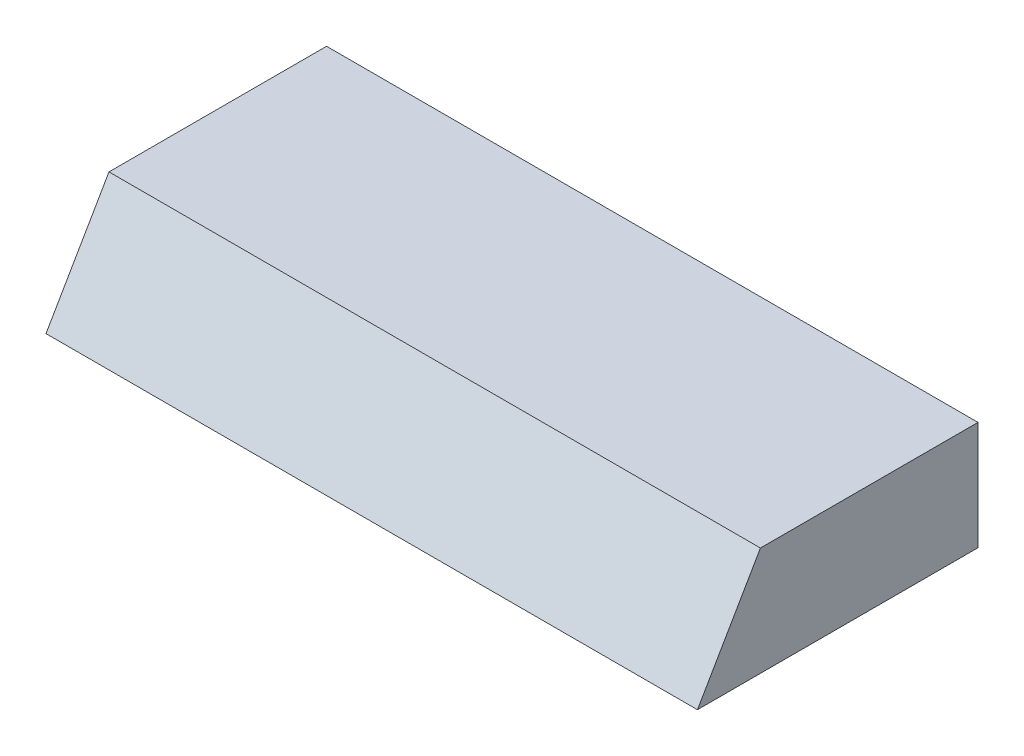
ISO-10303-21;
HEADER;
FILE_DESCRIPTION(('STEP AP214'),'2;1');
FILE_NAME('part.step','',(''),(''),'','','');
FILE_SCHEMA(('AUTOMOTIVE_DESIGN { 1 0 10303 214 1 1 1 1 }'));
ENDSEC;
DATA;
#1=APPLICATION_CONTEXT('core data for automotive mechanical design processes');
#2=APPLICATION_PROTOCOL_DEFINITION('international standard','automotive_design',2000,#1);
#3=PRODUCT_CONTEXT('',#1,'mechanical');
#4=PRODUCT('Part','Part','',(#3));
#5=PRODUCT_RELATED_PRODUCT_CATEGORY('part','',(#4));
#6=PRODUCT_DEFINITION_FORMATION('','',#4);
#7=PRODUCT_DEFINITION_CONTEXT('part definition',#1,'design');
#8=PRODUCT_DEFINITION('design','',#6,#7);
#9=PRODUCT_DEFINITION_SHAPE('','',#8);
#10=(LENGTH_UNIT() NAMED_UNIT(*) SI_UNIT(.MILLI.,.METRE.));
#11=(NAMED_UNIT(*) PLANE_ANGLE_UNIT() SI_UNIT($,.RADIAN.));
#12=(NAMED_UNIT(*) SI_UNIT($,.STERADIAN.) SOLID_ANGLE_UNIT());
#13=UNCERTAINTY_MEASURE_WITH_UNIT(LENGTH_MEASURE(1.E-05),#10,'distance_accuracy_value','');
#14=(GEOMETRIC_REPRESENTATION_CONTEXT(3) GLOBAL_UNCERTAINTY_ASSIGNED_CONTEXT((#13)) GLOBAL_UNIT_ASSIGNED_CONTEXT((#10,
#11,#12)) REPRESENTATION_CONTEXT('',''));
#15=CARTESIAN_POINT('',(0.,0.,0.));
#16=DIRECTION('',(0.,0.,1.));
#17=DIRECTION('',(1.,0.,0.));
#18=AXIS2_PLACEMENT_3D('',#15,#16,#17);
#19=CARTESIAN_POINT('',(-15.,-2.5,12.92));
#20=DIRECTION('',(1.,0.,0.));
#21=DIRECTION('',(0.,0.,-1.));
#22=AXIS2_PLACEMENT_3D('',#19,#20,#21);
#23=PLANE('',#22);
#24=DIRECTION('',(0.,0.,-1.));
#25=VECTOR('',#24,1.);
#26=CARTESIAN_POINT('',(-15.,-2.5,12.92));
#27=LINE('',#26,#25);
#28=CARTESIAN_POINT('',(-15.,-2.5,12.92));
#29=VERTEX_POINT('',#28);
#30=CARTESIAN_POINT('',(-15.,-2.5,0.));
#31=VERTEX_POINT('',#30);
#32=EDGE_CURVE('E11',#29,#31,#27,.T.);
#33=ORIENTED_EDGE('',*,*,#32,.F.);
#34=DIRECTION('',(0.,0.865031189261803,-0.501718089771846));
#35=VECTOR('',#34,1.);
#36=CARTESIAN_POINT('',(-15.,-2.5,12.92));
#37=LINE('',#36,#35);
#38=CARTESIAN_POINT('',(-15.,2.5,10.02));
#39=VERTEX_POINT('',#38);
#40=EDGE_CURVE('E48',#29,#39,#37,.T.);
#41=ORIENTED_EDGE('',*,*,#40,.T.);
#42=DIRECTION('',(0.,0.,-1.));
#43=VECTOR('',#42,1.);
#44=CARTESIAN_POINT('',(-15.,2.5,12.92));
#45=LINE('',#44,#43);
#46=CARTESIAN_POINT('',(-15.,2.5,0.));
#47=VERTEX_POINT('',#46);
#48=EDGE_CURVE('E77',#39,#47,#45,.T.);
#49=ORIENTED_EDGE('',*,*,#48,.T.);
#50=DIRECTION('',(0.,-1.,0.));
#51=VECTOR('',#50,1.);
#52=CARTESIAN_POINT('',(-15.,-2.5,0.));
#53=LINE('',#52,#51);
#54=EDGE_CURVE('E89',#47,#31,#53,.T.);
#55=ORIENTED_EDGE('',*,*,#54,.T.);
#56=EDGE_LOOP('',(#33,#41,#49,#55));
#57=FACE_BOUND('',#56,.T.);
#58=ADVANCED_FACE('F33',(#57),#23,.F.);
#59=CARTESIAN_POINT('',(15.,-2.5,12.92));
#60=DIRECTION('',(0.,1.,0.));
#61=DIRECTION('',(-1.,0.,0.));
#62=AXIS2_PLACEMENT_3D('',#59,#60,#61);
#63=PLANE('',#62);
#64=DIRECTION('',(1.,0.,0.));
#65=VECTOR('',#64,1.);
#66=CARTESIAN_POINT('',(15.,-2.5,0.));
#67=LINE('',#66,#65);
#68=CARTESIAN_POINT('',(15.,-2.5,0.));
#69=VERTEX_POINT('',#68);
#70=EDGE_CURVE('E85',#31,#69,#67,.T.);
#71=ORIENTED_EDGE('',*,*,#70,.T.);
#72=DIRECTION('',(0.,0.,-1.));
#73=VECTOR('',#72,1.);
#74=CARTESIAN_POINT('',(15.,-2.5,12.92));
#75=LINE('',#74,#73);
#76=CARTESIAN_POINT('',(15.,-2.5,12.92));
#77=VERTEX_POINT('',#76);
#78=EDGE_CURVE('E41',#77,#69,#75,.T.);
#79=ORIENTED_EDGE('',*,*,#78,.F.);
#80=DIRECTION('',(1.,0.,0.));
#81=VECTOR('',#80,1.);
#82=CARTESIAN_POINT('',(15.,-2.5,12.92));
#83=LINE('',#82,#81);
#84=EDGE_CURVE('E90',#29,#77,#83,.T.);
#85=ORIENTED_EDGE('',*,*,#84,.F.);
#86=ORIENTED_EDGE('',*,*,#32,.T.);
#87=EDGE_LOOP('',(#71,#79,#85,#86));
#88=FACE_BOUND('',#87,.T.);
#89=ADVANCED_FACE('F104',(#88),#63,.F.);
#90=CARTESIAN_POINT('',(15.,-2.5,12.92));
#91=DIRECTION('',(-1.,0.,0.));
#92=DIRECTION('',(0.,0.,1.));
#93=AXIS2_PLACEMENT_3D('',#90,#91,#92);
#94=PLANE('',#93);
#95=DIRECTION('',(0.,0.,-1.));
#96=VECTOR('',#95,1.);
#97=CARTESIAN_POINT('',(15.,2.5,12.92));
#98=LINE('',#97,#96);
#99=CARTESIAN_POINT('',(15.,2.5,10.02));
#100=VERTEX_POINT('',#99);
#101=CARTESIAN_POINT('',(15.,2.5,0.));
#102=VERTEX_POINT('',#101);
#103=EDGE_CURVE('E66',#100,#102,#98,.T.);
#104=ORIENTED_EDGE('',*,*,#103,.F.);
#105=DIRECTION('',(0.,0.865031189261803,-0.501718089771846));
#106=VECTOR('',#105,1.);
#107=CARTESIAN_POINT('',(15.,2.5,10.02));
#108=LINE('',#107,#106);
#109=EDGE_CURVE('E99',#77,#100,#108,.T.);
#110=ORIENTED_EDGE('',*,*,#109,.F.);
#111=ORIENTED_EDGE('',*,*,#78,.T.);
#112=DIRECTION('',(0.,1.,0.));
#113=VECTOR('',#112,1.);
#114=CARTESIAN_POINT('',(15.,-2.5,0.));
#115=LINE('',#114,#113);
#116=EDGE_CURVE('E81',#69,#102,#115,.T.);
#117=ORIENTED_EDGE('',*,*,#116,.T.);
#118=EDGE_LOOP('',(#104,#110,#111,#117));
#119=FACE_BOUND('',#118,.T.);
#120=ADVANCED_FACE('F82',(#119),#94,.F.);
#121=CARTESIAN_POINT('',(15.,2.5,12.92));
#122=DIRECTION('',(0.,-1.,0.));
#123=DIRECTION('',(1.,0.,0.));
#124=AXIS2_PLACEMENT_3D('',#121,#122,#123);
#125=PLANE('',#124);
#126=ORIENTED_EDGE('',*,*,#48,.F.);
#127=DIRECTION('',(1.,0.,0.));
#128=VECTOR('',#127,1.);
#129=CARTESIAN_POINT('',(-21.,2.5,10.02));
#130=LINE('',#129,#128);
#131=EDGE_CURVE('E74',#39,#100,#130,.T.);
#132=ORIENTED_EDGE('',*,*,#131,.T.);
#133=ORIENTED_EDGE('',*,*,#103,.T.);
#134=DIRECTION('',(-1.,0.,0.));
#135=VECTOR('',#134,1.);
#136=CARTESIAN_POINT('',(15.,2.5,0.));
#137=LINE('',#136,#135);
#138=EDGE_CURVE('E71',#102,#47,#137,.T.);
#139=ORIENTED_EDGE('',*,*,#138,.T.);
#140=EDGE_LOOP('',(#126,#132,#133,#139));
#141=FACE_BOUND('',#140,.T.);
#142=ADVANCED_FACE('F69',(#141),#125,.F.);
#143=CARTESIAN_POINT('',(0.,0.,0.));
#144=DIRECTION('',(0.,0.,1.));
#145=DIRECTION('',(1.,0.,0.));
#146=AXIS2_PLACEMENT_3D('',#143,#144,#145);
#147=PLANE('',#146);
#148=ORIENTED_EDGE('',*,*,#54,.F.);
#149=ORIENTED_EDGE('',*,*,#138,.F.);
#150=ORIENTED_EDGE('',*,*,#116,.F.);
#151=ORIENTED_EDGE('',*,*,#70,.F.);
#152=EDGE_LOOP('',(#148,#149,#150,#151));
#153=FACE_BOUND('',#152,.T.);
#154=ADVANCED_FACE('F87',(#153),#147,.F.);
#155=CARTESIAN_POINT('',(-21.,2.5,10.02));
#156=DIRECTION('',(0.,-0.501718089771846,-0.865031189261803));
#157=DIRECTION('',(0.,0.865031189261803,-0.501718089771846));
#158=AXIS2_PLACEMENT_3D('',#155,#156,#157);
#159=PLANE('',#158);
#160=ORIENTED_EDGE('',*,*,#84,.T.);
#161=ORIENTED_EDGE('',*,*,#109,.T.);
#162=ORIENTED_EDGE('',*,*,#131,.F.);
#163=ORIENTED_EDGE('',*,*,#40,.F.);
#164=EDGE_LOOP('',(#160,#161,#162,#163));
#165=FACE_BOUND('',#164,.T.);
#166=ADVANCED_FACE('F101',(#165),#159,.F.);
#167=CLOSED_SHELL('',(#58,#89,#120,#142,#154,#166));
#168=MANIFOLD_SOLID_BREP('B2',#167);
#169=ADVANCED_BREP_SHAPE_REPRESENTATION('',(#18,#168),#14);
#170=SHAPE_DEFINITION_REPRESENTATION(#9,#169);
ENDSEC;
END-ISO-10303-21;
